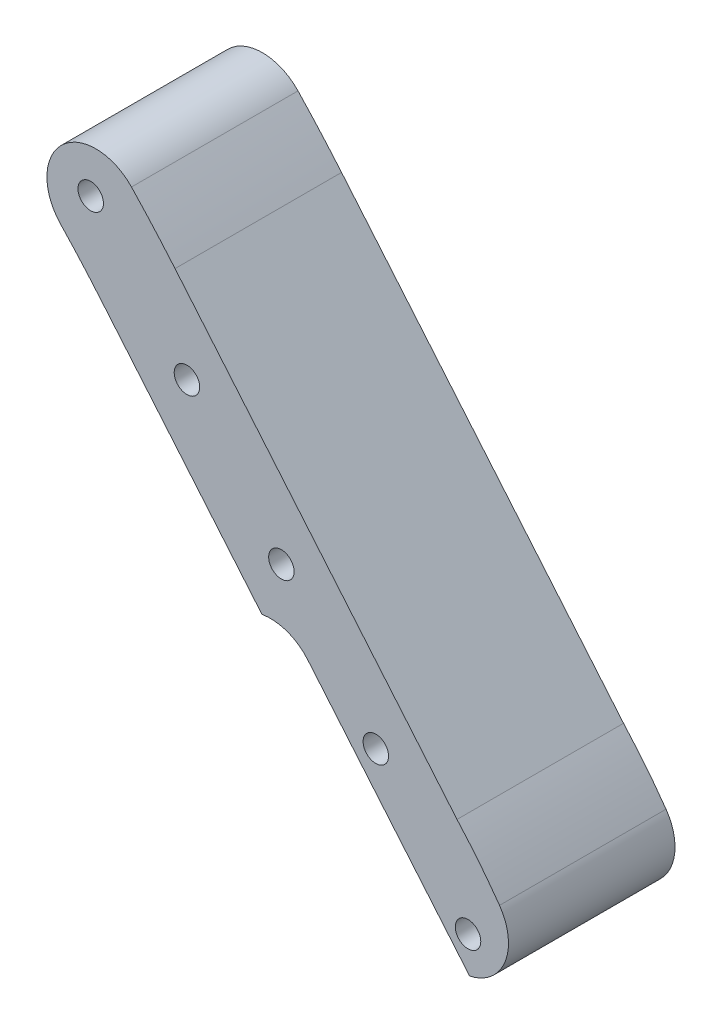
ISO-10303-21;
HEADER;
FILE_DESCRIPTION(('STEP AP214'),'2;1');
FILE_NAME('part.step','',(''),(''),'','','');
FILE_SCHEMA(('AUTOMOTIVE_DESIGN { 1 0 10303 214 1 1 1 1 }'));
ENDSEC;
DATA;
#1=APPLICATION_CONTEXT('core data for automotive mechanical design processes');
#2=APPLICATION_PROTOCOL_DEFINITION('international standard','automotive_design',2000,#1);
#3=PRODUCT_CONTEXT('',#1,'mechanical');
#4=PRODUCT('Part','Part','',(#3));
#5=PRODUCT_RELATED_PRODUCT_CATEGORY('part','',(#4));
#6=PRODUCT_DEFINITION_FORMATION('','',#4);
#7=PRODUCT_DEFINITION_CONTEXT('part definition',#1,'design');
#8=PRODUCT_DEFINITION('design','',#6,#7);
#9=PRODUCT_DEFINITION_SHAPE('','',#8);
#10=(LENGTH_UNIT() NAMED_UNIT(*) SI_UNIT(.MILLI.,.METRE.));
#11=(NAMED_UNIT(*) PLANE_ANGLE_UNIT() SI_UNIT($,.RADIAN.));
#12=(NAMED_UNIT(*) SI_UNIT($,.STERADIAN.) SOLID_ANGLE_UNIT());
#13=UNCERTAINTY_MEASURE_WITH_UNIT(LENGTH_MEASURE(1.E-05),#10,'distance_accuracy_value','');
#14=(GEOMETRIC_REPRESENTATION_CONTEXT(3) GLOBAL_UNCERTAINTY_ASSIGNED_CONTEXT((#13)) GLOBAL_UNIT_ASSIGNED_CONTEXT((#10,
#11,#12)) REPRESENTATION_CONTEXT('',''));
#15=CARTESIAN_POINT('',(0.,0.,0.));
#16=DIRECTION('',(0.,0.,1.));
#17=DIRECTION('',(1.,0.,0.));
#18=AXIS2_PLACEMENT_3D('',#15,#16,#17);
#19=CARTESIAN_POINT('',(-184.249134967911,-114.001155100364,-34.));
#20=DIRECTION('',(0.,0.,1.));
#21=DIRECTION('',(-1.,0.,0.));
#22=AXIS2_PLACEMENT_3D('',#19,#20,#21);
#23=CYLINDRICAL_SURFACE('',#22,205.);
#24=CARTESIAN_POINT('',(-184.249134967911,-114.001155100364,-34.));
#25=DIRECTION('',(0.,0.,1.));
#26=DIRECTION('',(1.,0.,0.));
#27=AXIS2_PLACEMENT_3D('',#24,#25,#26);
#28=CIRCLE('',#27,205.);
#29=CARTESIAN_POINT('',(-27.2100241285214,17.7703048853774,-34.));
#30=VERTEX_POINT('',#29);
#31=CARTESIAN_POINT('',(-35.3096206303586,26.8605539226844,-34.));
#32=VERTEX_POINT('',#31);
#33=EDGE_CURVE('E169',#30,#32,#28,.T.);
#34=ORIENTED_EDGE('',*,*,#33,.F.);
#35=DIRECTION('',(0.,0.,1.));
#36=VECTOR('',#35,1.);
#37=CARTESIAN_POINT('',(-27.2100241285214,17.7703048853774,-34.));
#38=LINE('',#37,#36);
#39=CARTESIAN_POINT('',(-27.2100241285214,17.7703048853774,0.));
#40=VERTEX_POINT('',#39);
#41=EDGE_CURVE('E177',#30,#40,#38,.T.);
#42=ORIENTED_EDGE('',*,*,#41,.T.);
#43=CARTESIAN_POINT('',(-184.249134967911,-114.001155100364,0.));
#44=DIRECTION('',(0.,0.,1.));
#45=DIRECTION('',(1.,0.,0.));
#46=AXIS2_PLACEMENT_3D('',#43,#44,#45);
#47=CIRCLE('',#46,205.);
#48=CARTESIAN_POINT('',(-35.3096206303586,26.8605539226844,0.));
#49=VERTEX_POINT('',#48);
#50=EDGE_CURVE('E139',#40,#49,#47,.T.);
#51=ORIENTED_EDGE('',*,*,#50,.T.);
#52=DIRECTION('',(0.,0.,1.));
#53=VECTOR('',#52,1.);
#54=CARTESIAN_POINT('',(-35.3096206303586,26.8605539226845,-34.));
#55=LINE('',#54,#53);
#56=EDGE_CURVE('E206',#32,#49,#55,.T.);
#57=ORIENTED_EDGE('',*,*,#56,.F.);
#58=EDGE_LOOP('',(#34,#42,#51,#57));
#59=FACE_BOUND('',#58,.T.);
#60=ADVANCED_FACE('F41',(#59),#23,.F.);
#61=CARTESIAN_POINT('',(-7.21733060410077,-6.05605944798554,-34.));
#62=DIRECTION('',(0.766044443118973,0.642787609686545,0.));
#63=DIRECTION('',(-0.642787609686545,0.766044443118973,0.));
#64=AXIS2_PLACEMENT_3D('',#61,#62,#63);
#65=PLANE('',#64);
#66=DIRECTION('',(0.642787609686545,-0.766044443118973,0.));
#67=VECTOR('',#66,1.);
#68=CARTESIAN_POINT('',(-7.21733060410077,-6.05605944798554,0.));
#69=LINE('',#68,#67);
#70=CARTESIAN_POINT('',(5.86131348132968,-21.6425805230581,0.));
#71=VERTEX_POINT('',#70);
#72=EDGE_CURVE('E129',#40,#71,#69,.T.);
#73=ORIENTED_EDGE('',*,*,#72,.F.);
#74=ORIENTED_EDGE('',*,*,#41,.F.);
#75=DIRECTION('',(0.642787609686545,-0.766044443118973,0.));
#76=VECTOR('',#75,1.);
#77=CARTESIAN_POINT('',(-7.21733060410077,-6.05605944798554,-34.));
#78=LINE('',#77,#76);
#79=CARTESIAN_POINT('',(5.86131348132968,-21.6425805230581,-34.));
#80=VERTEX_POINT('',#79);
#81=EDGE_CURVE('E131',#30,#80,#78,.T.);
#82=ORIENTED_EDGE('',*,*,#81,.T.);
#83=DIRECTION('',(0.,0.,-1.));
#84=VECTOR('',#83,1.);
#85=CARTESIAN_POINT('',(5.86131348132968,-21.6425805230581,0.));
#86=LINE('',#85,#84);
#87=EDGE_CURVE('E121',#71,#80,#86,.T.);
#88=ORIENTED_EDGE('',*,*,#87,.F.);
#89=EDGE_LOOP('',(#73,#74,#82,#88));
#90=FACE_BOUND('',#89,.T.);
#91=ADVANCED_FACE('F127',(#90),#65,.F.);
#92=CARTESIAN_POINT('',(-39.8093361834181,-115.297065699631,-34.));
#93=DIRECTION('',(0.,0.,1.));
#94=DIRECTION('',(-1.,0.,0.));
#95=AXIS2_PLACEMENT_3D('',#92,#93,#94);
#96=CYLINDRICAL_SURFACE('',#95,115.264599185311);
#97=CARTESIAN_POINT('',(-39.8093361834181,-115.297065699631,-34.));
#98=DIRECTION('',(0.,0.,1.));
#99=DIRECTION('',(1.,0.,0.));
#100=AXIS2_PLACEMENT_3D('',#97,#98,#99);
#101=CIRCLE('',#100,115.264599185311);
#102=CARTESIAN_POINT('',(54.3683809137307,-48.8404224822677,-34.));
#103=VERTEX_POINT('',#102);
#104=CARTESIAN_POINT('',(45.6869539137064,-37.9904540484996,-34.));
#105=VERTEX_POINT('',#104);
#106=EDGE_CURVE('E226',#103,#105,#101,.T.);
#107=ORIENTED_EDGE('',*,*,#106,.T.);
#108=DIRECTION('',(0.,0.,1.));
#109=VECTOR('',#108,1.);
#110=CARTESIAN_POINT('',(45.6869539137064,-37.9904540484996,-34.));
#111=LINE('',#110,#109);
#112=CARTESIAN_POINT('',(45.6869539137064,-37.9904540484996,0.));
#113=VERTEX_POINT('',#112);
#114=EDGE_CURVE('E173',#105,#113,#111,.T.);
#115=ORIENTED_EDGE('',*,*,#114,.T.);
#116=CARTESIAN_POINT('',(-39.8093361834181,-115.297065699631,0.));
#117=DIRECTION('',(0.,0.,1.));
#118=DIRECTION('',(1.,0.,0.));
#119=AXIS2_PLACEMENT_3D('',#116,#117,#118);
#120=CIRCLE('',#119,115.264599185311);
#121=CARTESIAN_POINT('',(54.3683809137307,-48.8404224822677,0.));
#122=VERTEX_POINT('',#121);
#123=EDGE_CURVE('E141',#122,#113,#120,.T.);
#124=ORIENTED_EDGE('',*,*,#123,.F.);
#125=DIRECTION('',(0.,0.,1.));
#126=VECTOR('',#125,1.);
#127=CARTESIAN_POINT('',(54.3683809137307,-48.8404224822677,-34.));
#128=LINE('',#127,#126);
#129=EDGE_CURVE('E179',#103,#122,#128,.T.);
#130=ORIENTED_EDGE('',*,*,#129,.F.);
#131=EDGE_LOOP('',(#107,#115,#124,#130));
#132=FACE_BOUND('',#131,.T.);
#133=ADVANCED_FACE('F273',(#132),#96,.T.);
#134=CARTESIAN_POINT('',(8.1035582582787,6.79969274574536,-34.));
#135=DIRECTION('',(0.766044443118973,0.642787609686545,0.));
#136=DIRECTION('',(-0.642787609686545,0.766044443118973,0.));
#137=AXIS2_PLACEMENT_3D('',#134,#135,#136);
#138=PLANE('',#137);
#139=DIRECTION('',(0.642787609686545,-0.766044443118974,0.));
#140=VECTOR('',#139,1.);
#141=CARTESIAN_POINT('',(8.1035582582787,6.79969274574536,0.));
#142=LINE('',#141,#140);
#143=CARTESIAN_POINT('',(-11.8891352661419,30.6260570791083,0.));
#144=VERTEX_POINT('',#143);
#145=EDGE_CURVE('E144',#144,#113,#142,.T.);
#146=ORIENTED_EDGE('',*,*,#145,.T.);
#147=ORIENTED_EDGE('',*,*,#114,.F.);
#148=DIRECTION('',(0.642787609686545,-0.766044443118974,0.));
#149=VECTOR('',#148,1.);
#150=CARTESIAN_POINT('',(8.1035582582787,6.79969274574536,-34.));
#151=LINE('',#150,#149);
#152=CARTESIAN_POINT('',(-11.8891352661419,30.6260570791083,-34.));
#153=VERTEX_POINT('',#152);
#154=EDGE_CURVE('E229',#153,#105,#151,.T.);
#155=ORIENTED_EDGE('',*,*,#154,.F.);
#156=DIRECTION('',(0.,0.,1.));
#157=VECTOR('',#156,1.);
#158=CARTESIAN_POINT('',(-11.8891352661419,30.6260570791083,-34.));
#159=LINE('',#158,#157);
#160=EDGE_CURVE('E170',#153,#144,#159,.T.);
#161=ORIENTED_EDGE('',*,*,#160,.T.);
#162=EDGE_LOOP('',(#146,#147,#155,#161));
#163=FACE_BOUND('',#162,.T.);
#164=ADVANCED_FACE('F300',(#163),#138,.T.);
#165=CARTESIAN_POINT('',(29.1110489444994,-33.7932980195512,-34.));
#166=DIRECTION('',(0.,0.,1.));
#167=DIRECTION('',(-1.,0.,0.));
#168=AXIS2_PLACEMENT_3D('',#165,#166,#167);
#169=CYLINDRICAL_SURFACE('',#168,2.59999999999999);
#170=CARTESIAN_POINT('',(29.1110489444994,-33.7932980195512,-34.));
#171=DIRECTION('',(0.,0.,1.));
#172=DIRECTION('',(1.,0.,0.));
#173=AXIS2_PLACEMENT_3D('',#170,#171,#172);
#174=CIRCLE('',#173,2.59999999999999);
#175=CARTESIAN_POINT('',(31.7110489444994,-33.7932980195512,-34.));
#176=VERTEX_POINT('',#175);
#177=EDGE_CURVE('E243',#176,#176,#174,.T.);
#178=ORIENTED_EDGE('',*,*,#177,.F.);
#179=EDGE_LOOP('',(#178));
#180=FACE_BOUND('',#179,.T.);
#181=CARTESIAN_POINT('',(29.1110489444994,-33.7932980195512,0.));
#182=DIRECTION('',(0.,0.,1.));
#183=DIRECTION('',(1.,0.,0.));
#184=AXIS2_PLACEMENT_3D('',#181,#182,#183);
#185=CIRCLE('',#184,2.59999999999999);
#186=CARTESIAN_POINT('',(31.7110489444994,-33.7932980195512,0.));
#187=VERTEX_POINT('',#186);
#188=EDGE_CURVE('E163',#187,#187,#185,.T.);
#189=ORIENTED_EDGE('',*,*,#188,.T.);
#190=EDGE_LOOP('',(#189));
#191=FACE_BOUND('',#190,.T.);
#192=ADVANCED_FACE('F404',(#180,#191),#169,.F.);
#193=CARTESIAN_POINT('',(9.82742065390303,-10.811964725982,-34.));
#194=DIRECTION('',(0.,0.,1.));
#195=DIRECTION('',(-1.,0.,0.));
#196=AXIS2_PLACEMENT_3D('',#193,#194,#195);
#197=CYLINDRICAL_SURFACE('',#196,2.59999999999999);
#198=CARTESIAN_POINT('',(9.82742065390303,-10.811964725982,-34.));
#199=DIRECTION('',(0.,0.,1.));
#200=DIRECTION('',(1.,0.,0.));
#201=AXIS2_PLACEMENT_3D('',#198,#199,#200);
#202=CIRCLE('',#201,2.59999999999999);
#203=CARTESIAN_POINT('',(12.427420653903,-10.811964725982,-34.));
#204=VERTEX_POINT('',#203);
#205=EDGE_CURVE('E240',#204,#204,#202,.T.);
#206=ORIENTED_EDGE('',*,*,#205,.F.);
#207=EDGE_LOOP('',(#206));
#208=FACE_BOUND('',#207,.T.);
#209=CARTESIAN_POINT('',(9.82742065390303,-10.811964725982,0.));
#210=DIRECTION('',(0.,0.,1.));
#211=DIRECTION('',(1.,0.,0.));
#212=AXIS2_PLACEMENT_3D('',#209,#210,#211);
#213=CIRCLE('',#212,2.59999999999999);
#214=CARTESIAN_POINT('',(12.427420653903,-10.811964725982,0.));
#215=VERTEX_POINT('',#214);
#216=EDGE_CURVE('E160',#215,#215,#213,.T.);
#217=ORIENTED_EDGE('',*,*,#216,.T.);
#218=EDGE_LOOP('',(#217));
#219=FACE_BOUND('',#218,.T.);
#220=ADVANCED_FACE('F393',(#208,#219),#197,.F.);
#221=CARTESIAN_POINT('',(-9.45620763669331,12.1693685675872,-34.));
#222=DIRECTION('',(0.,0.,1.));
#223=DIRECTION('',(-1.,0.,0.));
#224=AXIS2_PLACEMENT_3D('',#221,#222,#223);
#225=CYLINDRICAL_SURFACE('',#224,2.6);
#226=CARTESIAN_POINT('',(-9.45620763669331,12.1693685675872,-34.));
#227=DIRECTION('',(0.,0.,1.));
#228=DIRECTION('',(1.,0.,0.));
#229=AXIS2_PLACEMENT_3D('',#226,#227,#228);
#230=CIRCLE('',#229,2.6);
#231=CARTESIAN_POINT('',(-6.85620763669331,12.1693685675872,-34.));
#232=VERTEX_POINT('',#231);
#233=EDGE_CURVE('E237',#232,#232,#230,.T.);
#234=ORIENTED_EDGE('',*,*,#233,.F.);
#235=EDGE_LOOP('',(#234));
#236=FACE_BOUND('',#235,.T.);
#237=CARTESIAN_POINT('',(-9.45620763669331,12.1693685675872,0.));
#238=DIRECTION('',(0.,0.,1.));
#239=DIRECTION('',(1.,0.,0.));
#240=AXIS2_PLACEMENT_3D('',#237,#238,#239);
#241=CIRCLE('',#240,2.6);
#242=CARTESIAN_POINT('',(-6.85620763669331,12.1693685675872,0.));
#243=VERTEX_POINT('',#242);
#244=EDGE_CURVE('E157',#243,#243,#241,.T.);
#245=ORIENTED_EDGE('',*,*,#244,.T.);
#246=EDGE_LOOP('',(#245));
#247=FACE_BOUND('',#246,.T.);
#248=ADVANCED_FACE('F382',(#236,#247),#225,.F.);
#249=CARTESIAN_POINT('',(-29.1017941558242,34.842059857316,-34.));
#250=DIRECTION('',(0.,0.,1.));
#251=DIRECTION('',(-1.,0.,0.));
#252=AXIS2_PLACEMENT_3D('',#249,#250,#251);
#253=CYLINDRICAL_SURFACE('',#252,2.6);
#254=CARTESIAN_POINT('',(-29.1017941558242,34.842059857316,-34.));
#255=DIRECTION('',(0.,0.,1.));
#256=DIRECTION('',(1.,0.,0.));
#257=AXIS2_PLACEMENT_3D('',#254,#255,#256);
#258=CIRCLE('',#257,2.6);
#259=CARTESIAN_POINT('',(-26.5017941558242,34.842059857316,-34.));
#260=VERTEX_POINT('',#259);
#261=EDGE_CURVE('E234',#260,#260,#258,.T.);
#262=ORIENTED_EDGE('',*,*,#261,.F.);
#263=EDGE_LOOP('',(#262));
#264=FACE_BOUND('',#263,.T.);
#265=CARTESIAN_POINT('',(-29.1017941558242,34.842059857316,0.));
#266=DIRECTION('',(0.,0.,1.));
#267=DIRECTION('',(1.,0.,0.));
#268=AXIS2_PLACEMENT_3D('',#265,#266,#267);
#269=CIRCLE('',#268,2.6);
#270=CARTESIAN_POINT('',(-26.5017941558242,34.842059857316,0.));
#271=VERTEX_POINT('',#270);
#272=EDGE_CURVE('E154',#271,#271,#269,.T.);
#273=ORIENTED_EDGE('',*,*,#272,.T.);
#274=EDGE_LOOP('',(#273));
#275=FACE_BOUND('',#274,.T.);
#276=ADVANCED_FACE('F372',(#264,#275),#253,.F.);
#277=CARTESIAN_POINT('',(-184.249134967911,-114.001155100364,-34.));
#278=DIRECTION('',(0.,0.,1.));
#279=DIRECTION('',(-1.,0.,0.));
#280=AXIS2_PLACEMENT_3D('',#277,#278,#279);
#281=CYLINDRICAL_SURFACE('',#280,225.);
#282=CARTESIAN_POINT('',(-184.249134967911,-114.001155100364,0.));
#283=DIRECTION('',(0.,0.,1.));
#284=DIRECTION('',(1.,0.,0.));
#285=AXIS2_PLACEMENT_3D('',#282,#283,#284);
#286=CIRCLE('',#285,225.);
#287=CARTESIAN_POINT('',(-20.7789363047438,40.6031596810306,0.));
#288=VERTEX_POINT('',#287);
#289=EDGE_CURVE('E151',#144,#288,#286,.T.);
#290=ORIENTED_EDGE('',*,*,#289,.F.);
#291=ORIENTED_EDGE('',*,*,#160,.F.);
#292=CARTESIAN_POINT('',(-184.249134967911,-114.001155100364,-34.));
#293=DIRECTION('',(0.,0.,1.));
#294=DIRECTION('',(1.,0.,0.));
#295=AXIS2_PLACEMENT_3D('',#292,#293,#294);
#296=CIRCLE('',#295,225.);
#297=CARTESIAN_POINT('',(-20.7789363047438,40.6031596810306,-34.));
#298=VERTEX_POINT('',#297);
#299=EDGE_CURVE('E231',#153,#298,#296,.T.);
#300=ORIENTED_EDGE('',*,*,#299,.T.);
#301=DIRECTION('',(0.,0.,1.));
#302=VECTOR('',#301,1.);
#303=CARTESIAN_POINT('',(-20.7789363047438,40.6031596810307,-34.));
#304=LINE('',#303,#302);
#305=EDGE_CURVE('E203',#288,#298,#304,.F.);
#306=ORIENTED_EDGE('',*,*,#305,.F.);
#307=EDGE_LOOP('',(#290,#291,#300,#306));
#308=FACE_BOUND('',#307,.T.);
#309=ADVANCED_FACE('F252',(#308),#281,.T.);
#310=CARTESIAN_POINT('',(47.9379459289701,-57.1502659292805,-34.));
#311=DIRECTION('',(0.,0.,1.));
#312=DIRECTION('',(-1.,0.,0.));
#313=AXIS2_PLACEMENT_3D('',#310,#311,#312);
#314=CYLINDRICAL_SURFACE('',#313,2.59999999999999);
#315=CARTESIAN_POINT('',(47.9379459289701,-57.1502659292805,-34.));
#316=DIRECTION('',(0.,0.,1.));
#317=DIRECTION('',(1.,0.,0.));
#318=AXIS2_PLACEMENT_3D('',#315,#316,#317);
#319=CIRCLE('',#318,2.59999999999999);
#320=CARTESIAN_POINT('',(50.5379459289701,-57.1502659292805,-34.));
#321=VERTEX_POINT('',#320);
#322=EDGE_CURVE('E174',#321,#321,#319,.T.);
#323=ORIENTED_EDGE('',*,*,#322,.F.);
#324=EDGE_LOOP('',(#323));
#325=FACE_BOUND('',#324,.T.);
#326=CARTESIAN_POINT('',(47.9379459289701,-57.1502659292805,0.));
#327=DIRECTION('',(0.,0.,1.));
#328=DIRECTION('',(1.,0.,0.));
#329=AXIS2_PLACEMENT_3D('',#326,#327,#328);
#330=CIRCLE('',#329,2.59999999999999);
#331=CARTESIAN_POINT('',(50.5379459289701,-57.1502659292805,0.));
#332=VERTEX_POINT('',#331);
#333=EDGE_CURVE('E166',#332,#332,#330,.T.);
#334=ORIENTED_EDGE('',*,*,#333,.T.);
#335=EDGE_LOOP('',(#334));
#336=FACE_BOUND('',#335,.T.);
#337=ADVANCED_FACE('F249',(#325,#336),#314,.F.);
#338=CARTESIAN_POINT('',(0.,0.,-34.));
#339=DIRECTION('',(0.,0.,-1.));
#340=DIRECTION('',(1.,0.,0.));
#341=AXIS2_PLACEMENT_3D('',#338,#339,#340);
#342=PLANE('',#341);
#343=DIRECTION('',(-0.642787609686544,0.766044443118974,0.));
#344=VECTOR('',#343,1.);
#345=CARTESIAN_POINT('',(-3.38710838850589,-2.8421213995528,-34.));
#346=LINE('',#345,#344);
#347=CARTESIAN_POINT('',(48.2587922781172,-64.3913090617637,-34.));
#348=VERTEX_POINT('',#347);
#349=CARTESIAN_POINT('',(15.2582396891888,-25.0627819563147,-34.));
#350=VERTEX_POINT('',#349);
#351=EDGE_CURVE('E215',#348,#350,#346,.T.);
#352=ORIENTED_EDGE('',*,*,#351,.T.);
#353=CARTESIAN_POINT('',(7.59779525799906,-31.4906580531801,-34.));
#354=DIRECTION('',(0.,0.,1.));
#355=DIRECTION('',(1.,0.,0.));
#356=AXIS2_PLACEMENT_3D('',#353,#354,#355);
#357=CIRCLE('',#356,10.);
#358=EDGE_CURVE('E49',#80,#350,#357,.F.);
#359=ORIENTED_EDGE('',*,*,#358,.F.);
#360=ORIENTED_EDGE('',*,*,#81,.F.);
#361=ORIENTED_EDGE('',*,*,#33,.T.);
#362=CARTESIAN_POINT('',(-28.0442784675512,33.7318568018576,-34.));
#363=DIRECTION('',(0.,0.,1.));
#364=DIRECTION('',(1.,0.,0.));
#365=AXIS2_PLACEMENT_3D('',#362,#363,#364);
#366=CIRCLE('',#365,10.);
#367=CARTESIAN_POINT('',(-35.2460677608615,40.6697405551905,-34.));
#368=VERTEX_POINT('',#367);
#369=EDGE_CURVE('E193',#368,#32,#366,.T.);
#370=ORIENTED_EDGE('',*,*,#369,.F.);
#371=CARTESIAN_POINT('',(-28.0442784675512,33.7318568018576,-34.));
#372=DIRECTION('',(0.,0.,1.));
#373=DIRECTION('',(1.,0.,0.));
#374=AXIS2_PLACEMENT_3D('',#371,#372,#373);
#375=CIRCLE('',#374,10.);
#376=EDGE_CURVE('E195',#298,#368,#375,.T.);
#377=ORIENTED_EDGE('',*,*,#376,.F.);
#378=ORIENTED_EDGE('',*,*,#299,.F.);
#379=ORIENTED_EDGE('',*,*,#154,.T.);
#380=ORIENTED_EDGE('',*,*,#106,.F.);
#381=CARTESIAN_POINT('',(46.1978135614998,-54.6059952328848,-34.));
#382=DIRECTION('',(0.,0.,1.));
#383=DIRECTION('',(1.,0.,0.));
#384=AXIS2_PLACEMENT_3D('',#381,#382,#383);
#385=CIRCLE('',#384,10.);
#386=CARTESIAN_POINT('',(51.1611176425667,-63.2873322611808,-34.));
#387=VERTEX_POINT('',#386);
#388=EDGE_CURVE('E201',#387,#103,#385,.T.);
#389=ORIENTED_EDGE('',*,*,#388,.F.);
#390=CARTESIAN_POINT('',(46.1978135614998,-54.6059952328848,-34.));
#391=DIRECTION('',(0.,0.,1.));
#392=DIRECTION('',(1.,0.,0.));
#393=AXIS2_PLACEMENT_3D('',#390,#391,#392);
#394=CIRCLE('',#393,10.);
#395=EDGE_CURVE('E198',#348,#387,#394,.T.);
#396=ORIENTED_EDGE('',*,*,#395,.F.);
#397=EDGE_LOOP('',(#352,#359,#360,#361,#370,#377,#378,#379,#380,#389,#396));
#398=FACE_BOUND('',#397,.T.);
#399=ORIENTED_EDGE('',*,*,#261,.T.);
#400=EDGE_LOOP('',(#399));
#401=FACE_BOUND('',#400,.T.);
#402=ORIENTED_EDGE('',*,*,#233,.T.);
#403=EDGE_LOOP('',(#402));
#404=FACE_BOUND('',#403,.T.);
#405=ORIENTED_EDGE('',*,*,#205,.T.);
#406=EDGE_LOOP('',(#405));
#407=FACE_BOUND('',#406,.T.);
#408=ORIENTED_EDGE('',*,*,#177,.T.);
#409=EDGE_LOOP('',(#408));
#410=FACE_BOUND('',#409,.T.);
#411=ORIENTED_EDGE('',*,*,#322,.T.);
#412=EDGE_LOOP('',(#411));
#413=FACE_BOUND('',#412,.T.);
#414=ADVANCED_FACE('F216',(#398,#401,#404,#407,#410,#413),#342,.T.);
#415=CARTESIAN_POINT('',(0.,0.,0.));
#416=DIRECTION('',(0.,0.,-1.));
#417=DIRECTION('',(1.,0.,0.));
#418=AXIS2_PLACEMENT_3D('',#415,#416,#417);
#419=PLANE('',#418);
#420=CARTESIAN_POINT('',(46.1978135614998,-54.6059952328848,0.));
#421=DIRECTION('',(0.,0.,1.));
#422=DIRECTION('',(1.,0.,0.));
#423=AXIS2_PLACEMENT_3D('',#420,#421,#422);
#424=CIRCLE('',#423,10.);
#425=CARTESIAN_POINT('',(51.1611176425667,-63.2873322611808,0.));
#426=VERTEX_POINT('',#425);
#427=CARTESIAN_POINT('',(48.2587922781172,-64.3913090617637,0.));
#428=VERTEX_POINT('',#427);
#429=EDGE_CURVE('E187',#426,#428,#424,.F.);
#430=ORIENTED_EDGE('',*,*,#429,.F.);
#431=CARTESIAN_POINT('',(46.1978135614998,-54.6059952328848,0.));
#432=DIRECTION('',(0.,0.,1.));
#433=DIRECTION('',(1.,0.,0.));
#434=AXIS2_PLACEMENT_3D('',#431,#432,#433);
#435=CIRCLE('',#434,10.);
#436=EDGE_CURVE('E190',#122,#426,#435,.F.);
#437=ORIENTED_EDGE('',*,*,#436,.F.);
#438=ORIENTED_EDGE('',*,*,#123,.T.);
#439=ORIENTED_EDGE('',*,*,#145,.F.);
#440=ORIENTED_EDGE('',*,*,#289,.T.);
#441=CARTESIAN_POINT('',(-28.0442784675512,33.7318568018576,0.));
#442=DIRECTION('',(0.,0.,1.));
#443=DIRECTION('',(1.,0.,0.));
#444=AXIS2_PLACEMENT_3D('',#441,#442,#443);
#445=CIRCLE('',#444,10.);
#446=CARTESIAN_POINT('',(-35.2460677608615,40.6697405551905,0.));
#447=VERTEX_POINT('',#446);
#448=EDGE_CURVE('E185',#447,#288,#445,.F.);
#449=ORIENTED_EDGE('',*,*,#448,.F.);
#450=CARTESIAN_POINT('',(-28.0442784675512,33.7318568018576,0.));
#451=DIRECTION('',(0.,0.,1.));
#452=DIRECTION('',(1.,0.,0.));
#453=AXIS2_PLACEMENT_3D('',#450,#451,#452);
#454=CIRCLE('',#453,10.);
#455=EDGE_CURVE('E182',#49,#447,#454,.F.);
#456=ORIENTED_EDGE('',*,*,#455,.F.);
#457=ORIENTED_EDGE('',*,*,#50,.F.);
#458=ORIENTED_EDGE('',*,*,#72,.T.);
#459=CARTESIAN_POINT('',(7.59779525799906,-31.4906580531801,0.));
#460=DIRECTION('',(0.,0.,1.));
#461=DIRECTION('',(1.,0.,0.));
#462=AXIS2_PLACEMENT_3D('',#459,#460,#461);
#463=CIRCLE('',#462,10.);
#464=CARTESIAN_POINT('',(15.2582396891888,-25.0627819563147,0.));
#465=VERTEX_POINT('',#464);
#466=EDGE_CURVE('E11',#465,#71,#463,.T.);
#467=ORIENTED_EDGE('',*,*,#466,.F.);
#468=DIRECTION('',(-0.642787609686544,0.766044443118974,0.));
#469=VECTOR('',#468,1.);
#470=CARTESIAN_POINT('',(-3.38710838850589,-2.8421213995528,0.));
#471=LINE('',#470,#469);
#472=EDGE_CURVE('E133',#428,#465,#471,.T.);
#473=ORIENTED_EDGE('',*,*,#472,.F.);
#474=EDGE_LOOP('',(#430,#437,#438,#439,#440,#449,#456,#457,#458,#467,#473));
#475=FACE_BOUND('',#474,.T.);
#476=ORIENTED_EDGE('',*,*,#272,.F.);
#477=EDGE_LOOP('',(#476));
#478=FACE_BOUND('',#477,.T.);
#479=ORIENTED_EDGE('',*,*,#244,.F.);
#480=EDGE_LOOP('',(#479));
#481=FACE_BOUND('',#480,.T.);
#482=ORIENTED_EDGE('',*,*,#216,.F.);
#483=EDGE_LOOP('',(#482));
#484=FACE_BOUND('',#483,.T.);
#485=ORIENTED_EDGE('',*,*,#188,.F.);
#486=EDGE_LOOP('',(#485));
#487=FACE_BOUND('',#486,.T.);
#488=ORIENTED_EDGE('',*,*,#333,.F.);
#489=EDGE_LOOP('',(#488));
#490=FACE_BOUND('',#489,.T.);
#491=ADVANCED_FACE('F136',(#475,#478,#481,#484,#487,#490),#419,.F.);
#492=CARTESIAN_POINT('',(46.1978135614998,-54.6059952328848,-34.));
#493=DIRECTION('',(0.,0.,1.));
#494=DIRECTION('',(-1.,0.,0.));
#495=AXIS2_PLACEMENT_3D('',#492,#493,#494);
#496=CYLINDRICAL_SURFACE('',#495,10.);
#497=DIRECTION('',(0.,0.,-1.));
#498=VECTOR('',#497,1.);
#499=CARTESIAN_POINT('',(48.2587922781172,-64.3913090617637,0.));
#500=LINE('',#499,#498);
#501=EDGE_CURVE('E132',#428,#348,#500,.T.);
#502=ORIENTED_EDGE('',*,*,#501,.T.);
#503=ORIENTED_EDGE('',*,*,#395,.T.);
#504=DIRECTION('',(0.,0.,1.));
#505=VECTOR('',#504,1.);
#506=CARTESIAN_POINT('',(51.1611176425667,-63.2873322611808,-34.));
#507=LINE('',#506,#505);
#508=EDGE_CURVE('E146',#387,#426,#507,.T.);
#509=ORIENTED_EDGE('',*,*,#508,.T.);
#510=ORIENTED_EDGE('',*,*,#429,.T.);
#511=EDGE_LOOP('',(#502,#503,#509,#510));
#512=FACE_BOUND('',#511,.T.);
#513=ADVANCED_FACE('F257',(#512),#496,.T.);
#514=CARTESIAN_POINT('',(46.1978135614998,-54.6059952328848,-34.));
#515=DIRECTION('',(0.,0.,1.));
#516=DIRECTION('',(-1.,0.,0.));
#517=AXIS2_PLACEMENT_3D('',#514,#515,#516);
#518=CYLINDRICAL_SURFACE('',#517,10.);
#519=ORIENTED_EDGE('',*,*,#388,.T.);
#520=ORIENTED_EDGE('',*,*,#129,.T.);
#521=ORIENTED_EDGE('',*,*,#436,.T.);
#522=ORIENTED_EDGE('',*,*,#508,.F.);
#523=EDGE_LOOP('',(#519,#520,#521,#522));
#524=FACE_BOUND('',#523,.T.);
#525=ADVANCED_FACE('F263',(#524),#518,.T.);
#526=CARTESIAN_POINT('',(-28.0442784675512,33.7318568018576,-34.));
#527=DIRECTION('',(0.,0.,1.));
#528=DIRECTION('',(-1.,0.,0.));
#529=AXIS2_PLACEMENT_3D('',#526,#527,#528);
#530=CYLINDRICAL_SURFACE('',#529,10.);
#531=ORIENTED_EDGE('',*,*,#56,.T.);
#532=ORIENTED_EDGE('',*,*,#455,.T.);
#533=DIRECTION('',(0.,0.,-1.));
#534=VECTOR('',#533,1.);
#535=CARTESIAN_POINT('',(-35.2460677608615,40.6697405551905,-34.));
#536=LINE('',#535,#534);
#537=EDGE_CURVE('E210',#447,#368,#536,.T.);
#538=ORIENTED_EDGE('',*,*,#537,.T.);
#539=ORIENTED_EDGE('',*,*,#369,.T.);
#540=EDGE_LOOP('',(#531,#532,#538,#539));
#541=FACE_BOUND('',#540,.T.);
#542=ADVANCED_FACE('F279',(#541),#530,.T.);
#543=CARTESIAN_POINT('',(-28.0442784675512,33.7318568018576,-34.));
#544=DIRECTION('',(0.,0.,1.));
#545=DIRECTION('',(-1.,0.,0.));
#546=AXIS2_PLACEMENT_3D('',#543,#544,#545);
#547=CYLINDRICAL_SURFACE('',#546,10.);
#548=ORIENTED_EDGE('',*,*,#376,.T.);
#549=ORIENTED_EDGE('',*,*,#537,.F.);
#550=ORIENTED_EDGE('',*,*,#448,.T.);
#551=ORIENTED_EDGE('',*,*,#305,.T.);
#552=EDGE_LOOP('',(#548,#549,#550,#551));
#553=FACE_BOUND('',#552,.T.);
#554=ADVANCED_FACE('F282',(#553),#547,.T.);
#555=CARTESIAN_POINT('',(-3.38710838850589,-2.8421213995528,0.));
#556=DIRECTION('',(0.766044443118974,0.642787609686545,0.));
#557=DIRECTION('',(-0.642787609686545,0.766044443118974,0.));
#558=AXIS2_PLACEMENT_3D('',#555,#556,#557);
#559=PLANE('',#558);
#560=ORIENTED_EDGE('',*,*,#351,.F.);
#561=ORIENTED_EDGE('',*,*,#501,.F.);
#562=ORIENTED_EDGE('',*,*,#472,.T.);
#563=DIRECTION('',(0.,0.,1.));
#564=VECTOR('',#563,1.);
#565=CARTESIAN_POINT('',(15.2582396891888,-25.0627819563147,0.));
#566=LINE('',#565,#564);
#567=EDGE_CURVE('E55',#350,#465,#566,.T.);
#568=ORIENTED_EDGE('',*,*,#567,.F.);
#569=EDGE_LOOP('',(#560,#561,#562,#568));
#570=FACE_BOUND('',#569,.T.);
#571=ADVANCED_FACE('F284',(#570),#559,.F.);
#572=CARTESIAN_POINT('',(7.59779525799906,-31.4906580531801,0.));
#573=DIRECTION('',(0.,0.,1.));
#574=DIRECTION('',(-1.,0.,0.));
#575=AXIS2_PLACEMENT_3D('',#572,#573,#574);
#576=CYLINDRICAL_SURFACE('',#575,10.);
#577=ORIENTED_EDGE('',*,*,#466,.T.);
#578=ORIENTED_EDGE('',*,*,#87,.T.);
#579=ORIENTED_EDGE('',*,*,#358,.T.);
#580=ORIENTED_EDGE('',*,*,#567,.T.);
#581=EDGE_LOOP('',(#577,#578,#579,#580));
#582=FACE_BOUND('',#581,.T.);
#583=ADVANCED_FACE('F43',(#582),#576,.F.);
#584=CLOSED_SHELL('',(#60,#91,#133,#164,#192,#220,#248,#276,#309,#337,#414,#491,#513,#525,#542,
#554,#571,#583));
#585=MANIFOLD_SOLID_BREP('B2',#584);
#586=ADVANCED_BREP_SHAPE_REPRESENTATION('',(#18,#585),#14);
#587=SHAPE_DEFINITION_REPRESENTATION(#9,#586);
ENDSEC;
END-ISO-10303-21;
